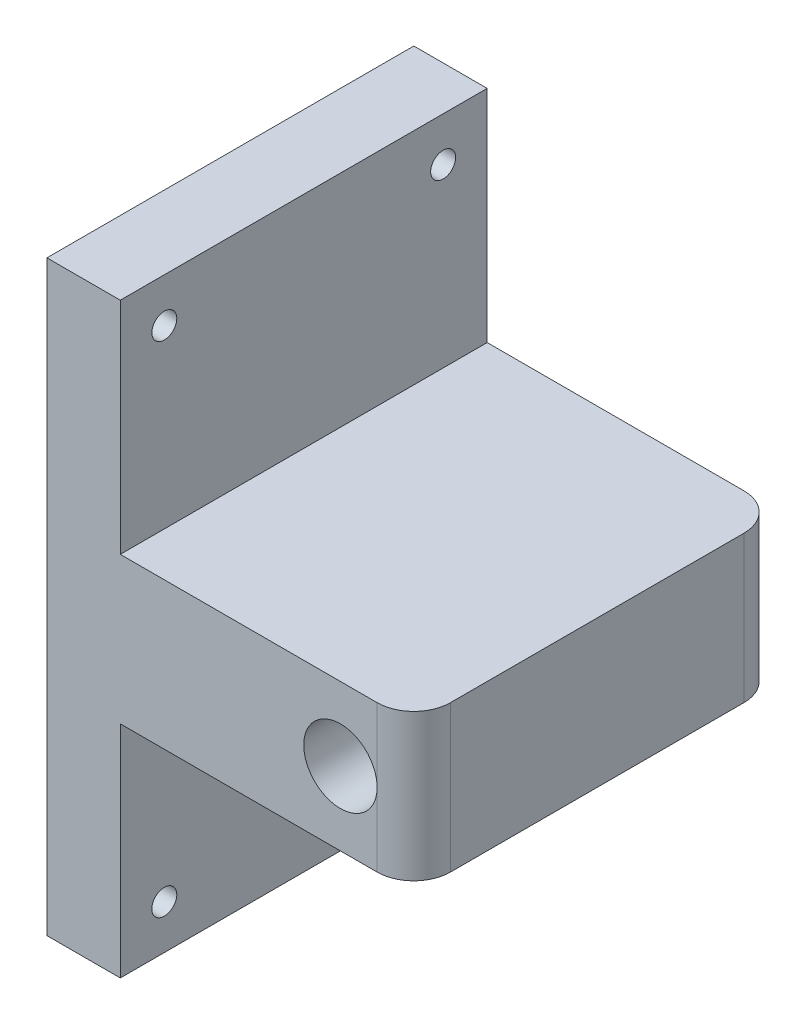
ISO-10303-21;
HEADER;
FILE_DESCRIPTION(('STEP AP214'),'2;1');
FILE_NAME('part.step','',(''),(''),'','','');
FILE_SCHEMA(('AUTOMOTIVE_DESIGN { 1 0 10303 214 1 1 1 1 }'));
ENDSEC;
DATA;
#1=APPLICATION_CONTEXT('core data for automotive mechanical design processes');
#2=APPLICATION_PROTOCOL_DEFINITION('international standard','automotive_design',2000,#1);
#3=PRODUCT_CONTEXT('',#1,'mechanical');
#4=PRODUCT('Part','Part','',(#3));
#5=PRODUCT_RELATED_PRODUCT_CATEGORY('part','',(#4));
#6=PRODUCT_DEFINITION_FORMATION('','',#4);
#7=PRODUCT_DEFINITION_CONTEXT('part definition',#1,'design');
#8=PRODUCT_DEFINITION('design','',#6,#7);
#9=PRODUCT_DEFINITION_SHAPE('','',#8);
#10=(LENGTH_UNIT() NAMED_UNIT(*) SI_UNIT(.MILLI.,.METRE.));
#11=(NAMED_UNIT(*) PLANE_ANGLE_UNIT() SI_UNIT($,.RADIAN.));
#12=(NAMED_UNIT(*) SI_UNIT($,.STERADIAN.) SOLID_ANGLE_UNIT());
#13=UNCERTAINTY_MEASURE_WITH_UNIT(LENGTH_MEASURE(1.E-05),#10,'distance_accuracy_value','');
#14=(GEOMETRIC_REPRESENTATION_CONTEXT(3) GLOBAL_UNCERTAINTY_ASSIGNED_CONTEXT((#13)) GLOBAL_UNIT_ASSIGNED_CONTEXT((#10,
#11,#12)) REPRESENTATION_CONTEXT('',''));
#15=CARTESIAN_POINT('',(0.,0.,0.));
#16=DIRECTION('',(0.,0.,1.));
#17=DIRECTION('',(1.,0.,0.));
#18=AXIS2_PLACEMENT_3D('',#15,#16,#17);
#19=CARTESIAN_POINT('',(0.,20.,-25.));
#20=DIRECTION('',(1.,0.,0.));
#21=DIRECTION('',(0.,0.,-1.));
#22=AXIS2_PLACEMENT_3D('',#19,#20,#21);
#23=PLANE('',#22);
#24=CARTESIAN_POINT('',(0.,44.,-19.));
#25=DIRECTION('',(-1.,0.,0.));
#26=DIRECTION('',(0.,0.,1.));
#27=AXIS2_PLACEMENT_3D('',#24,#25,#26);
#28=CIRCLE('',#27,1.725);
#29=CARTESIAN_POINT('',(0.,44.,-17.275));
#30=VERTEX_POINT('',#29);
#31=EDGE_CURVE('E564',#30,#30,#28,.T.);
#32=ORIENTED_EDGE('',*,*,#31,.F.);
#33=EDGE_LOOP('',(#32));
#34=FACE_BOUND('',#33,.T.);
#35=CARTESIAN_POINT('',(0.,44.,19.));
#36=DIRECTION('',(-1.,0.,0.));
#37=DIRECTION('',(0.,0.,1.));
#38=AXIS2_PLACEMENT_3D('',#35,#36,#37);
#39=CIRCLE('',#38,1.725);
#40=CARTESIAN_POINT('',(0.,44.,20.725));
#41=VERTEX_POINT('',#40);
#42=EDGE_CURVE('E264',#41,#41,#39,.T.);
#43=ORIENTED_EDGE('',*,*,#42,.F.);
#44=EDGE_LOOP('',(#43));
#45=FACE_BOUND('',#44,.T.);
#46=CARTESIAN_POINT('',(0.,-24.,-19.));
#47=DIRECTION('',(-1.,0.,0.));
#48=DIRECTION('',(0.,0.,1.));
#49=AXIS2_PLACEMENT_3D('',#46,#47,#48);
#50=CIRCLE('',#49,1.725);
#51=CARTESIAN_POINT('',(0.,-24.,-17.275));
#52=VERTEX_POINT('',#51);
#53=EDGE_CURVE('E255',#52,#52,#50,.T.);
#54=ORIENTED_EDGE('',*,*,#53,.F.);
#55=EDGE_LOOP('',(#54));
#56=FACE_BOUND('',#55,.T.);
#57=CARTESIAN_POINT('',(0.,-24.,19.));
#58=DIRECTION('',(-1.,0.,0.));
#59=DIRECTION('',(0.,0.,1.));
#60=AXIS2_PLACEMENT_3D('',#57,#58,#59);
#61=CIRCLE('',#60,1.725);
#62=CARTESIAN_POINT('',(0.,-24.,20.725));
#63=VERTEX_POINT('',#62);
#64=EDGE_CURVE('E250',#63,#63,#61,.T.);
#65=ORIENTED_EDGE('',*,*,#64,.F.);
#66=EDGE_LOOP('',(#65));
#67=FACE_BOUND('',#66,.T.);
#68=DIRECTION('',(0.,-1.,0.));
#69=VECTOR('',#68,1.);
#70=CARTESIAN_POINT('',(0.,20.,-25.));
#71=LINE('',#70,#69);
#72=CARTESIAN_POINT('',(0.,50.,-25.));
#73=VERTEX_POINT('',#72);
#74=CARTESIAN_POINT('',(0.,-30.,-25.));
#75=VERTEX_POINT('',#74);
#76=EDGE_CURVE('E138',#73,#75,#71,.T.);
#77=ORIENTED_EDGE('',*,*,#76,.T.);
#78=DIRECTION('',(0.,0.,1.));
#79=VECTOR('',#78,1.);
#80=CARTESIAN_POINT('',(0.,-30.,-25.));
#81=LINE('',#80,#79);
#82=CARTESIAN_POINT('',(0.,-30.,25.));
#83=VERTEX_POINT('',#82);
#84=EDGE_CURVE('E134',#75,#83,#81,.T.);
#85=ORIENTED_EDGE('',*,*,#84,.T.);
#86=DIRECTION('',(0.,-1.,0.));
#87=VECTOR('',#86,1.);
#88=CARTESIAN_POINT('',(0.,20.,25.));
#89=LINE('',#88,#87);
#90=CARTESIAN_POINT('',(0.,50.,25.));
#91=VERTEX_POINT('',#90);
#92=EDGE_CURVE('E129',#91,#83,#89,.T.);
#93=ORIENTED_EDGE('',*,*,#92,.F.);
#94=DIRECTION('',(0.,0.,1.));
#95=VECTOR('',#94,1.);
#96=CARTESIAN_POINT('',(0.,50.,-25.));
#97=LINE('',#96,#95);
#98=EDGE_CURVE('E132',#73,#91,#97,.T.);
#99=ORIENTED_EDGE('',*,*,#98,.F.);
#100=EDGE_LOOP('',(#77,#85,#93,#99));
#101=FACE_BOUND('',#100,.T.);
#102=ADVANCED_FACE('F43',(#34,#45,#56,#67,#101),#23,.F.);
#103=CARTESIAN_POINT('',(50.,20.,25.));
#104=DIRECTION('',(0.,0.,-1.));
#105=DIRECTION('',(-1.,0.,0.));
#106=AXIS2_PLACEMENT_3D('',#103,#104,#105);
#107=PLANE('',#106);
#108=DIRECTION('',(1.,0.,0.));
#109=VECTOR('',#108,1.);
#110=CARTESIAN_POINT('',(50.,20.,25.));
#111=LINE('',#110,#109);
#112=CARTESIAN_POINT('',(10.,20.,25.));
#113=VERTEX_POINT('',#112);
#114=CARTESIAN_POINT('',(45.,20.,25.));
#115=VERTEX_POINT('',#114);
#116=EDGE_CURVE('E198',#113,#115,#111,.T.);
#117=ORIENTED_EDGE('',*,*,#116,.F.);
#118=DIRECTION('',(0.,1.,0.));
#119=VECTOR('',#118,1.);
#120=CARTESIAN_POINT('',(10.,-30.,25.));
#121=LINE('',#120,#119);
#122=CARTESIAN_POINT('',(10.,50.,25.));
#123=VERTEX_POINT('',#122);
#124=EDGE_CURVE('E144',#113,#123,#121,.T.);
#125=ORIENTED_EDGE('',*,*,#124,.T.);
#126=DIRECTION('',(1.,0.,0.));
#127=VECTOR('',#126,1.);
#128=CARTESIAN_POINT('',(0.,50.,25.));
#129=LINE('',#128,#127);
#130=EDGE_CURVE('E141',#91,#123,#129,.T.);
#131=ORIENTED_EDGE('',*,*,#130,.F.);
#132=ORIENTED_EDGE('',*,*,#92,.T.);
#133=DIRECTION('',(1.,0.,0.));
#134=VECTOR('',#133,1.);
#135=CARTESIAN_POINT('',(0.,-30.,25.));
#136=LINE('',#135,#134);
#137=CARTESIAN_POINT('',(10.,-30.,25.));
#138=VERTEX_POINT('',#137);
#139=EDGE_CURVE('E171',#83,#138,#136,.T.);
#140=ORIENTED_EDGE('',*,*,#139,.T.);
#141=CARTESIAN_POINT('',(10.,0.,25.));
#142=VERTEX_POINT('',#141);
#143=EDGE_CURVE('E69',#138,#142,#121,.T.);
#144=ORIENTED_EDGE('',*,*,#143,.T.);
#145=DIRECTION('',(1.,0.,0.));
#146=VECTOR('',#145,1.);
#147=CARTESIAN_POINT('',(50.,0.,25.));
#148=LINE('',#147,#146);
#149=CARTESIAN_POINT('',(45.,0.,25.));
#150=VERTEX_POINT('',#149);
#151=EDGE_CURVE('E197',#142,#150,#148,.T.);
#152=ORIENTED_EDGE('',*,*,#151,.T.);
#153=DIRECTION('',(0.,-1.,0.));
#154=VECTOR('',#153,1.);
#155=CARTESIAN_POINT('',(45.,20.,25.));
#156=LINE('',#155,#154);
#157=CARTESIAN_POINT('',(45.,10.,25.));
#158=VERTEX_POINT('',#157);
#159=EDGE_CURVE('E53',#150,#158,#156,.F.);
#160=ORIENTED_EDGE('',*,*,#159,.T.);
#161=CARTESIAN_POINT('',(40.,10.,25.));
#162=DIRECTION('',(0.,0.,1.));
#163=DIRECTION('',(1.,0.,0.));
#164=AXIS2_PLACEMENT_3D('',#161,#162,#163);
#165=CIRCLE('',#164,5.);
#166=EDGE_CURVE('E191',#158,#158,#165,.T.);
#167=ORIENTED_EDGE('',*,*,#166,.F.);
#168=EDGE_CURVE('E243',#158,#115,#156,.F.);
#169=ORIENTED_EDGE('',*,*,#168,.T.);
#170=EDGE_LOOP('',(#117,#125,#131,#132,#140,#144,#152,#160,#167,#169));
#171=FACE_BOUND('',#170,.T.);
#172=ADVANCED_FACE('F142',(#171),#107,.F.);
#173=CARTESIAN_POINT('',(50.,20.,-25.));
#174=DIRECTION('',(-1.,0.,0.));
#175=DIRECTION('',(0.,0.,1.));
#176=AXIS2_PLACEMENT_3D('',#173,#174,#175);
#177=PLANE('',#176);
#178=DIRECTION('',(0.,0.,-1.));
#179=VECTOR('',#178,1.);
#180=CARTESIAN_POINT('',(50.,0.,-25.));
#181=LINE('',#180,#179);
#182=CARTESIAN_POINT('',(50.,0.,20.));
#183=VERTEX_POINT('',#182);
#184=CARTESIAN_POINT('',(50.,0.,-20.));
#185=VERTEX_POINT('',#184);
#186=EDGE_CURVE('E210',#183,#185,#181,.T.);
#187=ORIENTED_EDGE('',*,*,#186,.T.);
#188=DIRECTION('',(0.,-1.,0.));
#189=VECTOR('',#188,1.);
#190=CARTESIAN_POINT('',(50.,20.,-20.));
#191=LINE('',#190,#189);
#192=CARTESIAN_POINT('',(50.,20.,-20.));
#193=VERTEX_POINT('',#192);
#194=EDGE_CURVE('E234',#185,#193,#191,.F.);
#195=ORIENTED_EDGE('',*,*,#194,.T.);
#196=DIRECTION('',(0.,0.,-1.));
#197=VECTOR('',#196,1.);
#198=CARTESIAN_POINT('',(50.,20.,-25.));
#199=LINE('',#198,#197);
#200=CARTESIAN_POINT('',(50.,20.,20.));
#201=VERTEX_POINT('',#200);
#202=EDGE_CURVE('E201',#201,#193,#199,.T.);
#203=ORIENTED_EDGE('',*,*,#202,.F.);
#204=DIRECTION('',(0.,-1.,0.));
#205=VECTOR('',#204,1.);
#206=CARTESIAN_POINT('',(50.,20.,20.));
#207=LINE('',#206,#205);
#208=EDGE_CURVE('E230',#201,#183,#207,.T.);
#209=ORIENTED_EDGE('',*,*,#208,.T.);
#210=EDGE_LOOP('',(#187,#195,#203,#209));
#211=FACE_BOUND('',#210,.T.);
#212=ADVANCED_FACE('F304',(#211),#177,.F.);
#213=CARTESIAN_POINT('',(0.,20.,-25.));
#214=DIRECTION('',(0.,0.,1.));
#215=DIRECTION('',(1.,0.,0.));
#216=AXIS2_PLACEMENT_3D('',#213,#214,#215);
#217=PLANE('',#216);
#218=DIRECTION('',(-1.,0.,0.));
#219=VECTOR('',#218,1.);
#220=CARTESIAN_POINT('',(0.,0.,-25.));
#221=LINE('',#220,#219);
#222=CARTESIAN_POINT('',(45.,0.,-25.));
#223=VERTEX_POINT('',#222);
#224=CARTESIAN_POINT('',(10.,0.,-25.));
#225=VERTEX_POINT('',#224);
#226=EDGE_CURVE('E202',#223,#225,#221,.T.);
#227=ORIENTED_EDGE('',*,*,#226,.T.);
#228=DIRECTION('',(0.,1.,0.));
#229=VECTOR('',#228,1.);
#230=CARTESIAN_POINT('',(10.,-30.,-25.));
#231=LINE('',#230,#229);
#232=CARTESIAN_POINT('',(10.,-30.,-25.));
#233=VERTEX_POINT('',#232);
#234=EDGE_CURVE('E182',#233,#225,#231,.T.);
#235=ORIENTED_EDGE('',*,*,#234,.F.);
#236=DIRECTION('',(-1.,0.,0.));
#237=VECTOR('',#236,1.);
#238=CARTESIAN_POINT('',(0.,-30.,-25.));
#239=LINE('',#238,#237);
#240=EDGE_CURVE('E178',#233,#75,#239,.T.);
#241=ORIENTED_EDGE('',*,*,#240,.T.);
#242=ORIENTED_EDGE('',*,*,#76,.F.);
#243=DIRECTION('',(-1.,0.,0.));
#244=VECTOR('',#243,1.);
#245=CARTESIAN_POINT('',(0.,50.,-25.));
#246=LINE('',#245,#244);
#247=CARTESIAN_POINT('',(10.,50.,-25.));
#248=VERTEX_POINT('',#247);
#249=EDGE_CURVE('E154',#248,#73,#246,.T.);
#250=ORIENTED_EDGE('',*,*,#249,.F.);
#251=CARTESIAN_POINT('',(10.,20.,-25.));
#252=VERTEX_POINT('',#251);
#253=EDGE_CURVE('E186',#252,#248,#231,.T.);
#254=ORIENTED_EDGE('',*,*,#253,.F.);
#255=DIRECTION('',(-1.,0.,0.));
#256=VECTOR('',#255,1.);
#257=CARTESIAN_POINT('',(0.,20.,-25.));
#258=LINE('',#257,#256);
#259=CARTESIAN_POINT('',(45.,20.,-25.));
#260=VERTEX_POINT('',#259);
#261=EDGE_CURVE('E61',#260,#252,#258,.T.);
#262=ORIENTED_EDGE('',*,*,#261,.F.);
#263=DIRECTION('',(0.,-1.,0.));
#264=VECTOR('',#263,1.);
#265=CARTESIAN_POINT('',(45.,20.,-25.));
#266=LINE('',#265,#264);
#267=CARTESIAN_POINT('',(45.,10.,-25.));
#268=VERTEX_POINT('',#267);
#269=EDGE_CURVE('E219',#260,#268,#266,.T.);
#270=ORIENTED_EDGE('',*,*,#269,.T.);
#271=CARTESIAN_POINT('',(40.,10.,-25.));
#272=DIRECTION('',(0.,0.,1.));
#273=DIRECTION('',(1.,0.,0.));
#274=AXIS2_PLACEMENT_3D('',#271,#272,#273);
#275=CIRCLE('',#274,5.);
#276=EDGE_CURVE('E194',#268,#268,#275,.F.);
#277=ORIENTED_EDGE('',*,*,#276,.F.);
#278=EDGE_CURVE('E137',#268,#223,#266,.T.);
#279=ORIENTED_EDGE('',*,*,#278,.T.);
#280=EDGE_LOOP('',(#227,#235,#241,#242,#250,#254,#262,#270,#277,#279));
#281=FACE_BOUND('',#280,.T.);
#282=ADVANCED_FACE('F330',(#281),#217,.F.);
#283=CARTESIAN_POINT('',(0.,20.,0.));
#284=DIRECTION('',(0.,-1.,0.));
#285=DIRECTION('',(0.,0.,-1.));
#286=AXIS2_PLACEMENT_3D('',#283,#284,#285);
#287=PLANE('',#286);
#288=ORIENTED_EDGE('',*,*,#261,.T.);
#289=DIRECTION('',(0.,0.,1.));
#290=VECTOR('',#289,1.);
#291=CARTESIAN_POINT('',(10.,20.,0.));
#292=LINE('',#291,#290);
#293=EDGE_CURVE('E185',#252,#113,#292,.T.);
#294=ORIENTED_EDGE('',*,*,#293,.T.);
#295=ORIENTED_EDGE('',*,*,#116,.T.);
#296=CARTESIAN_POINT('',(45.,20.,20.));
#297=DIRECTION('',(0.,-1.,0.));
#298=DIRECTION('',(0.,0.,-1.));
#299=AXIS2_PLACEMENT_3D('',#296,#297,#298);
#300=CIRCLE('',#299,5.);
#301=EDGE_CURVE('E237',#115,#201,#300,.F.);
#302=ORIENTED_EDGE('',*,*,#301,.T.);
#303=ORIENTED_EDGE('',*,*,#202,.T.);
#304=CARTESIAN_POINT('',(45.,20.,-20.));
#305=DIRECTION('',(0.,-1.,0.));
#306=DIRECTION('',(0.,0.,-1.));
#307=AXIS2_PLACEMENT_3D('',#304,#305,#306);
#308=CIRCLE('',#307,5.);
#309=EDGE_CURVE('E240',#193,#260,#308,.F.);
#310=ORIENTED_EDGE('',*,*,#309,.T.);
#311=EDGE_LOOP('',(#288,#294,#295,#302,#303,#310));
#312=FACE_BOUND('',#311,.T.);
#313=ADVANCED_FACE('F319',(#312),#287,.F.);
#314=CARTESIAN_POINT('',(0.,0.,0.));
#315=DIRECTION('',(0.,-1.,0.));
#316=DIRECTION('',(0.,0.,-1.));
#317=AXIS2_PLACEMENT_3D('',#314,#315,#316);
#318=PLANE('',#317);
#319=DIRECTION('',(0.,0.,1.));
#320=VECTOR('',#319,1.);
#321=CARTESIAN_POINT('',(10.,0.,0.));
#322=LINE('',#321,#320);
#323=EDGE_CURVE('E11',#225,#142,#322,.T.);
#324=ORIENTED_EDGE('',*,*,#323,.F.);
#325=ORIENTED_EDGE('',*,*,#226,.F.);
#326=CARTESIAN_POINT('',(45.,0.,-20.));
#327=DIRECTION('',(0.,-1.,0.));
#328=DIRECTION('',(0.,0.,-1.));
#329=AXIS2_PLACEMENT_3D('',#326,#327,#328);
#330=CIRCLE('',#329,5.);
#331=EDGE_CURVE('E227',#223,#185,#330,.T.);
#332=ORIENTED_EDGE('',*,*,#331,.T.);
#333=ORIENTED_EDGE('',*,*,#186,.F.);
#334=CARTESIAN_POINT('',(45.,0.,20.));
#335=DIRECTION('',(0.,-1.,0.));
#336=DIRECTION('',(0.,0.,-1.));
#337=AXIS2_PLACEMENT_3D('',#334,#335,#336);
#338=CIRCLE('',#337,5.);
#339=EDGE_CURVE('E223',#183,#150,#338,.T.);
#340=ORIENTED_EDGE('',*,*,#339,.T.);
#341=ORIENTED_EDGE('',*,*,#151,.F.);
#342=EDGE_LOOP('',(#324,#325,#332,#333,#340,#341));
#343=FACE_BOUND('',#342,.T.);
#344=ADVANCED_FACE('F311',(#343),#318,.T.);
#345=CARTESIAN_POINT('',(45.,20.,-20.));
#346=DIRECTION('',(0.,-1.,0.));
#347=DIRECTION('',(0.,0.,-1.));
#348=AXIS2_PLACEMENT_3D('',#345,#346,#347);
#349=CYLINDRICAL_SURFACE('',#348,5.);
#350=ORIENTED_EDGE('',*,*,#309,.F.);
#351=ORIENTED_EDGE('',*,*,#194,.F.);
#352=ORIENTED_EDGE('',*,*,#331,.F.);
#353=ORIENTED_EDGE('',*,*,#278,.F.);
#354=ORIENTED_EDGE('',*,*,#269,.F.);
#355=EDGE_LOOP('',(#350,#351,#352,#353,#354));
#356=FACE_BOUND('',#355,.T.);
#357=ADVANCED_FACE('F309',(#356),#349,.T.);
#358=CARTESIAN_POINT('',(45.,20.,20.));
#359=DIRECTION('',(0.,-1.,0.));
#360=DIRECTION('',(0.,0.,-1.));
#361=AXIS2_PLACEMENT_3D('',#358,#359,#360);
#362=CYLINDRICAL_SURFACE('',#361,5.);
#363=ORIENTED_EDGE('',*,*,#301,.F.);
#364=ORIENTED_EDGE('',*,*,#168,.F.);
#365=ORIENTED_EDGE('',*,*,#159,.F.);
#366=ORIENTED_EDGE('',*,*,#339,.F.);
#367=ORIENTED_EDGE('',*,*,#208,.F.);
#368=EDGE_LOOP('',(#363,#364,#365,#366,#367));
#369=FACE_BOUND('',#368,.T.);
#370=ADVANCED_FACE('F45',(#369),#362,.T.);
#371=CARTESIAN_POINT('',(40.,10.,-25.001));
#372=DIRECTION('',(0.,0.,1.));
#373=DIRECTION('',(1.,0.,0.));
#374=AXIS2_PLACEMENT_3D('',#371,#372,#373);
#375=CYLINDRICAL_SURFACE('',#374,5.);
#376=ORIENTED_EDGE('',*,*,#166,.T.);
#377=EDGE_LOOP('',(#376));
#378=FACE_BOUND('',#377,.T.);
#379=ORIENTED_EDGE('',*,*,#276,.T.);
#380=EDGE_LOOP('',(#379));
#381=FACE_BOUND('',#380,.T.);
#382=ADVANCED_FACE('F317',(#378,#381),#375,.F.);
#383=CARTESIAN_POINT('',(0.,-30.,0.));
#384=DIRECTION('',(0.,1.,0.));
#385=DIRECTION('',(0.,0.,1.));
#386=AXIS2_PLACEMENT_3D('',#383,#384,#385);
#387=PLANE('',#386);
#388=ORIENTED_EDGE('',*,*,#84,.F.);
#389=ORIENTED_EDGE('',*,*,#240,.F.);
#390=DIRECTION('',(0.,0.,-1.));
#391=VECTOR('',#390,1.);
#392=CARTESIAN_POINT('',(10.,-30.,-25.));
#393=LINE('',#392,#391);
#394=EDGE_CURVE('E174',#138,#233,#393,.T.);
#395=ORIENTED_EDGE('',*,*,#394,.F.);
#396=ORIENTED_EDGE('',*,*,#139,.F.);
#397=EDGE_LOOP('',(#388,#389,#395,#396));
#398=FACE_BOUND('',#397,.T.);
#399=ADVANCED_FACE('F350',(#398),#387,.F.);
#400=CARTESIAN_POINT('',(10.,-30.,-25.));
#401=DIRECTION('',(1.,0.,0.));
#402=DIRECTION('',(0.,0.,-1.));
#403=AXIS2_PLACEMENT_3D('',#400,#401,#402);
#404=PLANE('',#403);
#405=CARTESIAN_POINT('',(10.,-24.,-19.));
#406=DIRECTION('',(1.,0.,0.));
#407=DIRECTION('',(0.,0.,-1.));
#408=AXIS2_PLACEMENT_3D('',#405,#406,#407);
#409=CIRCLE('',#408,1.69999999999999);
#410=CARTESIAN_POINT('',(10.,-24.,-20.7));
#411=VERTEX_POINT('',#410);
#412=EDGE_CURVE('E247',#411,#411,#409,.T.);
#413=ORIENTED_EDGE('',*,*,#412,.F.);
#414=EDGE_LOOP('',(#413));
#415=FACE_BOUND('',#414,.T.);
#416=CARTESIAN_POINT('',(10.,-24.,19.));
#417=DIRECTION('',(1.,0.,0.));
#418=DIRECTION('',(0.,0.,-1.));
#419=AXIS2_PLACEMENT_3D('',#416,#417,#418);
#420=CIRCLE('',#419,1.69999999999999);
#421=CARTESIAN_POINT('',(10.,-24.,17.3));
#422=VERTEX_POINT('',#421);
#423=EDGE_CURVE('E156',#422,#422,#420,.T.);
#424=ORIENTED_EDGE('',*,*,#423,.F.);
#425=EDGE_LOOP('',(#424));
#426=FACE_BOUND('',#425,.T.);
#427=ORIENTED_EDGE('',*,*,#234,.T.);
#428=ORIENTED_EDGE('',*,*,#323,.T.);
#429=ORIENTED_EDGE('',*,*,#143,.F.);
#430=ORIENTED_EDGE('',*,*,#394,.T.);
#431=EDGE_LOOP('',(#427,#428,#429,#430));
#432=FACE_BOUND('',#431,.T.);
#433=ADVANCED_FACE('F356',(#415,#426,#432),#404,.T.);
#434=CARTESIAN_POINT('',(10.,44.,-19.));
#435=DIRECTION('',(1.,0.,0.));
#436=DIRECTION('',(0.,0.,-1.));
#437=AXIS2_PLACEMENT_3D('',#434,#435,#436);
#438=CIRCLE('',#437,1.69999999999999);
#439=CARTESIAN_POINT('',(10.,44.,-20.7));
#440=VERTEX_POINT('',#439);
#441=EDGE_CURVE('E47',#440,#440,#438,.T.);
#442=ORIENTED_EDGE('',*,*,#441,.F.);
#443=EDGE_LOOP('',(#442));
#444=FACE_BOUND('',#443,.T.);
#445=CARTESIAN_POINT('',(10.,44.,19.));
#446=DIRECTION('',(1.,0.,0.));
#447=DIRECTION('',(0.,0.,-1.));
#448=AXIS2_PLACEMENT_3D('',#445,#446,#447);
#449=CIRCLE('',#448,1.69999999999999);
#450=CARTESIAN_POINT('',(10.,44.,17.3));
#451=VERTEX_POINT('',#450);
#452=EDGE_CURVE('E252',#451,#451,#449,.T.);
#453=ORIENTED_EDGE('',*,*,#452,.F.);
#454=EDGE_LOOP('',(#453));
#455=FACE_BOUND('',#454,.T.);
#456=ORIENTED_EDGE('',*,*,#293,.F.);
#457=ORIENTED_EDGE('',*,*,#253,.T.);
#458=DIRECTION('',(0.,0.,-1.));
#459=VECTOR('',#458,1.);
#460=CARTESIAN_POINT('',(10.,50.,-25.));
#461=LINE('',#460,#459);
#462=EDGE_CURVE('E149',#123,#248,#461,.T.);
#463=ORIENTED_EDGE('',*,*,#462,.F.);
#464=ORIENTED_EDGE('',*,*,#124,.F.);
#465=EDGE_LOOP('',(#456,#457,#463,#464));
#466=FACE_BOUND('',#465,.T.);
#467=ADVANCED_FACE('F400',(#444,#455,#466),#404,.T.);
#468=CARTESIAN_POINT('',(0.,50.,0.));
#469=DIRECTION('',(0.,1.,0.));
#470=DIRECTION('',(0.,0.,1.));
#471=AXIS2_PLACEMENT_3D('',#468,#469,#470);
#472=PLANE('',#471);
#473=ORIENTED_EDGE('',*,*,#98,.T.);
#474=ORIENTED_EDGE('',*,*,#130,.T.);
#475=ORIENTED_EDGE('',*,*,#462,.T.);
#476=ORIENTED_EDGE('',*,*,#249,.T.);
#477=EDGE_LOOP('',(#473,#474,#475,#476));
#478=FACE_BOUND('',#477,.T.);
#479=ADVANCED_FACE('F152',(#478),#472,.T.);
#480=CARTESIAN_POINT('',(0.,-24.,19.));
#481=DIRECTION('',(-1.,0.,0.));
#482=DIRECTION('',(0.,0.,1.));
#483=AXIS2_PLACEMENT_3D('',#480,#481,#482);
#484=CYLINDRICAL_SURFACE('',#483,1.69999999999999);
#485=ORIENTED_EDGE('',*,*,#423,.T.);
#486=EDGE_LOOP('',(#485));
#487=FACE_BOUND('',#486,.T.);
#488=CARTESIAN_POINT('',(0.0250000000000111,-24.,19.));
#489=DIRECTION('',(-1.,0.,0.));
#490=DIRECTION('',(0.,0.,1.));
#491=AXIS2_PLACEMENT_3D('',#488,#489,#490);
#492=CIRCLE('',#491,1.69999999999999);
#493=CARTESIAN_POINT('',(0.0250000000000111,-24.,20.7));
#494=VERTEX_POINT('',#493);
#495=EDGE_CURVE('E160',#494,#494,#492,.T.);
#496=ORIENTED_EDGE('',*,*,#495,.T.);
#497=EDGE_LOOP('',(#496));
#498=FACE_BOUND('',#497,.T.);
#499=ADVANCED_FACE('F283',(#487,#498),#484,.F.);
#500=CARTESIAN_POINT('',(0.,-24.,19.));
#501=DIRECTION('',(-1.,0.,0.));
#502=DIRECTION('',(0.,0.,1.));
#503=AXIS2_PLACEMENT_3D('',#500,#501,#502);
#504=CONICAL_SURFACE('',#503,1.725,0.785398163397483);
#505=ORIENTED_EDGE('',*,*,#495,.F.);
#506=EDGE_LOOP('',(#505));
#507=FACE_BOUND('',#506,.T.);
#508=ORIENTED_EDGE('',*,*,#64,.T.);
#509=EDGE_LOOP('',(#508));
#510=FACE_BOUND('',#509,.T.);
#511=ADVANCED_FACE('F285',(#507,#510),#504,.F.);
#512=CARTESIAN_POINT('',(0.,-24.,-19.));
#513=DIRECTION('',(-1.,0.,0.));
#514=DIRECTION('',(0.,0.,1.));
#515=AXIS2_PLACEMENT_3D('',#512,#513,#514);
#516=CYLINDRICAL_SURFACE('',#515,1.69999999999999);
#517=ORIENTED_EDGE('',*,*,#412,.T.);
#518=EDGE_LOOP('',(#517));
#519=FACE_BOUND('',#518,.T.);
#520=CARTESIAN_POINT('',(0.0250000000000111,-24.,-19.));
#521=DIRECTION('',(-1.,0.,0.));
#522=DIRECTION('',(0.,0.,1.));
#523=AXIS2_PLACEMENT_3D('',#520,#521,#522);
#524=CIRCLE('',#523,1.69999999999999);
#525=CARTESIAN_POINT('',(0.0250000000000111,-24.,-17.3));
#526=VERTEX_POINT('',#525);
#527=EDGE_CURVE('E251',#526,#526,#524,.T.);
#528=ORIENTED_EDGE('',*,*,#527,.T.);
#529=EDGE_LOOP('',(#528));
#530=FACE_BOUND('',#529,.T.);
#531=ADVANCED_FACE('F287',(#519,#530),#516,.F.);
#532=CARTESIAN_POINT('',(0.,-24.,-19.));
#533=DIRECTION('',(-1.,0.,0.));
#534=DIRECTION('',(0.,0.,1.));
#535=AXIS2_PLACEMENT_3D('',#532,#533,#534);
#536=CONICAL_SURFACE('',#535,1.725,0.785398163397483);
#537=ORIENTED_EDGE('',*,*,#527,.F.);
#538=EDGE_LOOP('',(#537));
#539=FACE_BOUND('',#538,.T.);
#540=ORIENTED_EDGE('',*,*,#53,.T.);
#541=EDGE_LOOP('',(#540));
#542=FACE_BOUND('',#541,.T.);
#543=ADVANCED_FACE('F293',(#539,#542),#536,.F.);
#544=CARTESIAN_POINT('',(0.,44.,19.));
#545=DIRECTION('',(-1.,0.,0.));
#546=DIRECTION('',(0.,0.,1.));
#547=AXIS2_PLACEMENT_3D('',#544,#545,#546);
#548=CYLINDRICAL_SURFACE('',#547,1.69999999999999);
#549=ORIENTED_EDGE('',*,*,#452,.T.);
#550=EDGE_LOOP('',(#549));
#551=FACE_BOUND('',#550,.T.);
#552=CARTESIAN_POINT('',(0.0250000000000111,44.,19.));
#553=DIRECTION('',(-1.,0.,0.));
#554=DIRECTION('',(0.,0.,1.));
#555=AXIS2_PLACEMENT_3D('',#552,#553,#554);
#556=CIRCLE('',#555,1.69999999999999);
#557=CARTESIAN_POINT('',(0.0250000000000111,44.,20.7));
#558=VERTEX_POINT('',#557);
#559=EDGE_CURVE('E256',#558,#558,#556,.T.);
#560=ORIENTED_EDGE('',*,*,#559,.T.);
#561=EDGE_LOOP('',(#560));
#562=FACE_BOUND('',#561,.T.);
#563=ADVANCED_FACE('F453',(#551,#562),#548,.F.);
#564=CARTESIAN_POINT('',(0.,44.,19.));
#565=DIRECTION('',(-1.,0.,0.));
#566=DIRECTION('',(0.,0.,1.));
#567=AXIS2_PLACEMENT_3D('',#564,#565,#566);
#568=CONICAL_SURFACE('',#567,1.725,0.785398163397414);
#569=ORIENTED_EDGE('',*,*,#559,.F.);
#570=EDGE_LOOP('',(#569));
#571=FACE_BOUND('',#570,.T.);
#572=ORIENTED_EDGE('',*,*,#42,.T.);
#573=EDGE_LOOP('',(#572));
#574=FACE_BOUND('',#573,.T.);
#575=ADVANCED_FACE('F464',(#571,#574),#568,.F.);
#576=CARTESIAN_POINT('',(0.,44.,-19.));
#577=DIRECTION('',(-1.,0.,0.));
#578=DIRECTION('',(0.,0.,1.));
#579=AXIS2_PLACEMENT_3D('',#576,#577,#578);
#580=CYLINDRICAL_SURFACE('',#579,1.69999999999999);
#581=ORIENTED_EDGE('',*,*,#441,.T.);
#582=EDGE_LOOP('',(#581));
#583=FACE_BOUND('',#582,.T.);
#584=CARTESIAN_POINT('',(0.0250000000000111,44.,-19.));
#585=DIRECTION('',(-1.,0.,0.));
#586=DIRECTION('',(0.,0.,1.));
#587=AXIS2_PLACEMENT_3D('',#584,#585,#586);
#588=CIRCLE('',#587,1.69999999999999);
#589=CARTESIAN_POINT('',(0.0250000000000111,44.,-17.3));
#590=VERTEX_POINT('',#589);
#591=EDGE_CURVE('E562',#590,#590,#588,.T.);
#592=ORIENTED_EDGE('',*,*,#591,.T.);
#593=EDGE_LOOP('',(#592));
#594=FACE_BOUND('',#593,.T.);
#595=ADVANCED_FACE('F474',(#583,#594),#580,.F.);
#596=CARTESIAN_POINT('',(0.,44.,-19.));
#597=DIRECTION('',(-1.,0.,0.));
#598=DIRECTION('',(0.,0.,1.));
#599=AXIS2_PLACEMENT_3D('',#596,#597,#598);
#600=CONICAL_SURFACE('',#599,1.725,0.785398163397414);
#601=ORIENTED_EDGE('',*,*,#591,.F.);
#602=EDGE_LOOP('',(#601));
#603=FACE_BOUND('',#602,.T.);
#604=ORIENTED_EDGE('',*,*,#31,.T.);
#605=EDGE_LOOP('',(#604));
#606=FACE_BOUND('',#605,.T.);
#607=ADVANCED_FACE('F485',(#603,#606),#600,.F.);
#608=CLOSED_SHELL('',(#102,#172,#212,#282,#313,#344,#357,#370,#382,#399,#433,#467,#479,#499,
#511,#531,#543,#563,#575,#595,#607));
#609=MANIFOLD_SOLID_BREP('B2',#608);
#610=ADVANCED_BREP_SHAPE_REPRESENTATION('',(#18,#609),#14);
#611=SHAPE_DEFINITION_REPRESENTATION(#9,#610);
ENDSEC;
END-ISO-10303-21;
